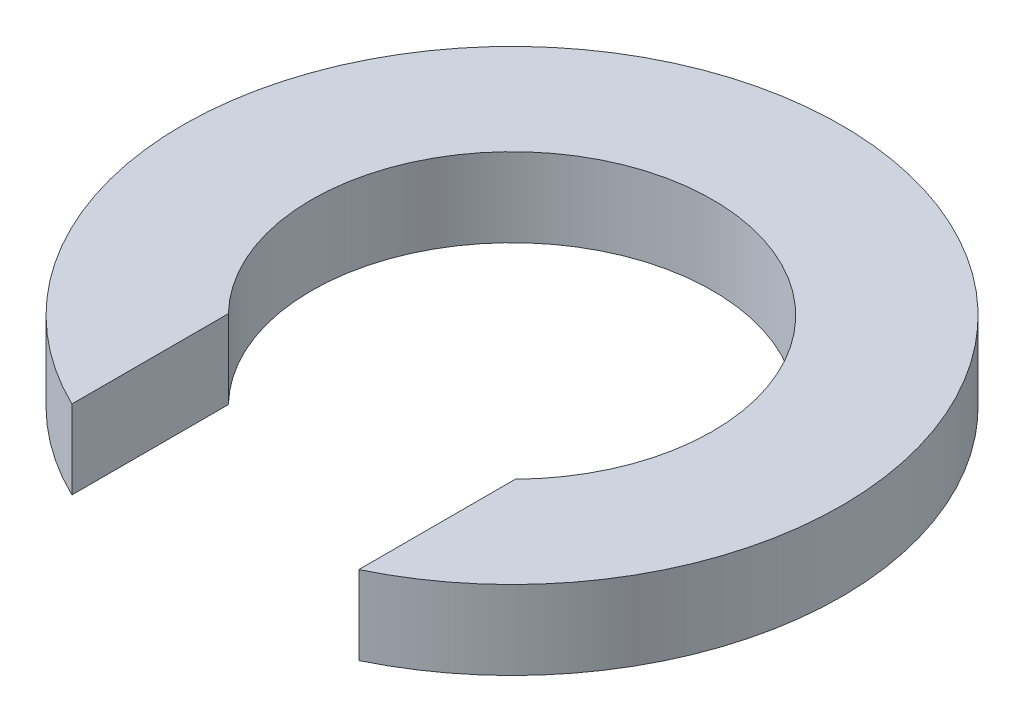
ISO-10303-21;
HEADER;
FILE_DESCRIPTION(('STEP AP214'),'2;1');
FILE_NAME('part.step','',(''),(''),'','','');
FILE_SCHEMA(('AUTOMOTIVE_DESIGN { 1 0 10303 214 1 1 1 1 }'));
ENDSEC;
DATA;
#1=APPLICATION_CONTEXT('core data for automotive mechanical design processes');
#2=APPLICATION_PROTOCOL_DEFINITION('international standard','automotive_design',2000,#1);
#3=PRODUCT_CONTEXT('',#1,'mechanical');
#4=PRODUCT('Part','Part','',(#3));
#5=PRODUCT_RELATED_PRODUCT_CATEGORY('part','',(#4));
#6=PRODUCT_DEFINITION_FORMATION('','',#4);
#7=PRODUCT_DEFINITION_CONTEXT('part definition',#1,'design');
#8=PRODUCT_DEFINITION('design','',#6,#7);
#9=PRODUCT_DEFINITION_SHAPE('','',#8);
#10=(LENGTH_UNIT() NAMED_UNIT(*) SI_UNIT(.MILLI.,.METRE.));
#11=(NAMED_UNIT(*) PLANE_ANGLE_UNIT() SI_UNIT($,.RADIAN.));
#12=(NAMED_UNIT(*) SI_UNIT($,.STERADIAN.) SOLID_ANGLE_UNIT());
#13=UNCERTAINTY_MEASURE_WITH_UNIT(LENGTH_MEASURE(1.E-05),#10,'distance_accuracy_value','');
#14=(GEOMETRIC_REPRESENTATION_CONTEXT(3) GLOBAL_UNCERTAINTY_ASSIGNED_CONTEXT((#13)) GLOBAL_UNIT_ASSIGNED_CONTEXT((#10,
#11,#12)) REPRESENTATION_CONTEXT('',''));
#15=CARTESIAN_POINT('',(0.,0.,0.));
#16=DIRECTION('',(0.,0.,1.));
#17=DIRECTION('',(1.,0.,0.));
#18=AXIS2_PLACEMENT_3D('',#15,#16,#17);
#19=CARTESIAN_POINT('',(0.,2.75,0.));
#20=DIRECTION('',(0.,1.,0.));
#21=DIRECTION('',(0.,0.,1.));
#22=AXIS2_PLACEMENT_3D('',#19,#20,#21);
#23=PLANE('',#22);
#24=DIRECTION('',(0.,0.,1.));
#25=VECTOR('',#24,1.);
#26=CARTESIAN_POINT('',(-5.0052393464597,2.75,4.89362637362638));
#27=LINE('',#26,#25);
#28=CARTESIAN_POINT('',(-5.0052393464597,2.75,4.89362637362638));
#29=VERTEX_POINT('',#28);
#30=CARTESIAN_POINT('',(-5.0052393464597,2.75,10.3536263736264));
#31=VERTEX_POINT('',#30);
#32=EDGE_CURVE('E122',#29,#31,#27,.T.);
#33=ORIENTED_EDGE('',*,*,#32,.F.);
#34=CARTESIAN_POINT('',(0.,2.75,0.));
#35=DIRECTION('',(0.,1.,0.));
#36=DIRECTION('',(0.,0.,1.));
#37=AXIS2_PLACEMENT_3D('',#34,#35,#36);
#38=CIRCLE('',#37,7.);
#39=CARTESIAN_POINT('',(5.00523934645971,2.75,4.89362637362637));
#40=VERTEX_POINT('',#39);
#41=EDGE_CURVE('E106',#40,#29,#38,.T.);
#42=ORIENTED_EDGE('',*,*,#41,.F.);
#43=DIRECTION('',(0.,0.,-1.));
#44=VECTOR('',#43,1.);
#45=CARTESIAN_POINT('',(5.00523934645971,2.75,4.89362637362637));
#46=LINE('',#45,#44);
#47=CARTESIAN_POINT('',(5.00523934645971,2.75,10.3536263736264));
#48=VERTEX_POINT('',#47);
#49=EDGE_CURVE('E69',#48,#40,#46,.T.);
#50=ORIENTED_EDGE('',*,*,#49,.F.);
#51=CARTESIAN_POINT('',(0.,2.75,0.));
#52=DIRECTION('',(0.,1.,0.));
#53=DIRECTION('',(0.,0.,1.));
#54=AXIS2_PLACEMENT_3D('',#51,#52,#53);
#55=CIRCLE('',#54,11.5);
#56=EDGE_CURVE('E11',#48,#31,#55,.T.);
#57=ORIENTED_EDGE('',*,*,#56,.T.);
#58=EDGE_LOOP('',(#33,#42,#50,#57));
#59=FACE_BOUND('',#58,.T.);
#60=ADVANCED_FACE('F45',(#59),#23,.T.);
#61=CARTESIAN_POINT('',(0.,0.,0.));
#62=DIRECTION('',(0.,1.,0.));
#63=DIRECTION('',(0.,0.,1.));
#64=AXIS2_PLACEMENT_3D('',#61,#62,#63);
#65=PLANE('',#64);
#66=CARTESIAN_POINT('',(0.,0.,0.));
#67=DIRECTION('',(0.,1.,0.));
#68=DIRECTION('',(0.,0.,1.));
#69=AXIS2_PLACEMENT_3D('',#66,#67,#68);
#70=CIRCLE('',#69,7.);
#71=CARTESIAN_POINT('',(5.00523934645971,0.,4.89362637362637));
#72=VERTEX_POINT('',#71);
#73=CARTESIAN_POINT('',(-5.00523934645971,0.,4.89362637362637));
#74=VERTEX_POINT('',#73);
#75=EDGE_CURVE('E100',#72,#74,#70,.T.);
#76=ORIENTED_EDGE('',*,*,#75,.T.);
#77=DIRECTION('',(0.,0.,1.));
#78=VECTOR('',#77,1.);
#79=CARTESIAN_POINT('',(-5.0052393464597,0.,4.89362637362638));
#80=LINE('',#79,#78);
#81=CARTESIAN_POINT('',(-5.0052393464597,0.,10.3536263736264));
#82=VERTEX_POINT('',#81);
#83=EDGE_CURVE('E61',#74,#82,#80,.T.);
#84=ORIENTED_EDGE('',*,*,#83,.T.);
#85=CARTESIAN_POINT('',(0.,0.,0.));
#86=DIRECTION('',(0.,1.,0.));
#87=DIRECTION('',(0.,0.,1.));
#88=AXIS2_PLACEMENT_3D('',#85,#86,#87);
#89=CIRCLE('',#88,11.5);
#90=CARTESIAN_POINT('',(5.00523934645971,0.,10.3536263736264));
#91=VERTEX_POINT('',#90);
#92=EDGE_CURVE('E49',#91,#82,#89,.T.);
#93=ORIENTED_EDGE('',*,*,#92,.F.);
#94=DIRECTION('',(0.,0.,-1.));
#95=VECTOR('',#94,1.);
#96=CARTESIAN_POINT('',(5.00523934645971,0.,4.89362637362637));
#97=LINE('',#96,#95);
#98=EDGE_CURVE('E87',#91,#72,#97,.T.);
#99=ORIENTED_EDGE('',*,*,#98,.T.);
#100=EDGE_LOOP('',(#76,#84,#93,#99));
#101=FACE_BOUND('',#100,.T.);
#102=ADVANCED_FACE('F99',(#101),#65,.F.);
#103=CARTESIAN_POINT('',(0.,2.75,0.));
#104=DIRECTION('',(0.,-1.,0.));
#105=DIRECTION('',(0.,0.,-1.));
#106=AXIS2_PLACEMENT_3D('',#103,#104,#105);
#107=CYLINDRICAL_SURFACE('',#106,11.5);
#108=ORIENTED_EDGE('',*,*,#92,.T.);
#109=DIRECTION('',(0.,-1.,0.));
#110=VECTOR('',#109,1.);
#111=CARTESIAN_POINT('',(-5.0052393464597,2.75,10.3536263736264));
#112=LINE('',#111,#110);
#113=EDGE_CURVE('E107',#82,#31,#112,.F.);
#114=ORIENTED_EDGE('',*,*,#113,.T.);
#115=ORIENTED_EDGE('',*,*,#56,.F.);
#116=DIRECTION('',(0.,-1.,0.));
#117=VECTOR('',#116,1.);
#118=CARTESIAN_POINT('',(5.00523934645971,2.75,10.3536263736264));
#119=LINE('',#118,#117);
#120=EDGE_CURVE('E113',#48,#91,#119,.T.);
#121=ORIENTED_EDGE('',*,*,#120,.T.);
#122=EDGE_LOOP('',(#108,#114,#115,#121));
#123=FACE_BOUND('',#122,.T.);
#124=ADVANCED_FACE('F47',(#123),#107,.T.);
#125=CARTESIAN_POINT('',(0.,2.75,0.));
#126=DIRECTION('',(0.,-1.,0.));
#127=DIRECTION('',(0.,0.,-1.));
#128=AXIS2_PLACEMENT_3D('',#125,#126,#127);
#129=CYLINDRICAL_SURFACE('',#128,7.);
#130=DIRECTION('',(0.,1.,0.));
#131=VECTOR('',#130,1.);
#132=CARTESIAN_POINT('',(-5.0052393464597,0.,4.89362637362638));
#133=LINE('',#132,#131);
#134=EDGE_CURVE('E94',#74,#29,#133,.T.);
#135=ORIENTED_EDGE('',*,*,#134,.F.);
#136=ORIENTED_EDGE('',*,*,#75,.F.);
#137=DIRECTION('',(0.,1.,0.));
#138=VECTOR('',#137,1.);
#139=CARTESIAN_POINT('',(5.00523934645971,0.,4.89362637362637));
#140=LINE('',#139,#138);
#141=EDGE_CURVE('E84',#72,#40,#140,.T.);
#142=ORIENTED_EDGE('',*,*,#141,.T.);
#143=ORIENTED_EDGE('',*,*,#41,.T.);
#144=EDGE_LOOP('',(#135,#136,#142,#143));
#145=FACE_BOUND('',#144,.T.);
#146=ADVANCED_FACE('F104',(#145),#129,.F.);
#147=CARTESIAN_POINT('',(5.00523934645971,0.,4.89362637362637));
#148=DIRECTION('',(1.,0.,0.));
#149=DIRECTION('',(0.,0.,-1.));
#150=AXIS2_PLACEMENT_3D('',#147,#148,#149);
#151=PLANE('',#150);
#152=ORIENTED_EDGE('',*,*,#49,.T.);
#153=ORIENTED_EDGE('',*,*,#141,.F.);
#154=ORIENTED_EDGE('',*,*,#98,.F.);
#155=ORIENTED_EDGE('',*,*,#120,.F.);
#156=EDGE_LOOP('',(#152,#153,#154,#155));
#157=FACE_BOUND('',#156,.T.);
#158=ADVANCED_FACE('F86',(#157),#151,.F.);
#159=CARTESIAN_POINT('',(-5.0052393464597,0.,4.89362637362638));
#160=DIRECTION('',(-1.,0.,0.));
#161=DIRECTION('',(0.,0.,1.));
#162=AXIS2_PLACEMENT_3D('',#159,#160,#161);
#163=PLANE('',#162);
#164=ORIENTED_EDGE('',*,*,#83,.F.);
#165=ORIENTED_EDGE('',*,*,#134,.T.);
#166=ORIENTED_EDGE('',*,*,#32,.T.);
#167=ORIENTED_EDGE('',*,*,#113,.F.);
#168=EDGE_LOOP('',(#164,#165,#166,#167));
#169=FACE_BOUND('',#168,.T.);
#170=ADVANCED_FACE('F131',(#169),#163,.F.);
#171=CLOSED_SHELL('',(#60,#102,#124,#146,#158,#170));
#172=MANIFOLD_SOLID_BREP('B2',#171);
#173=ADVANCED_BREP_SHAPE_REPRESENTATION('',(#18,#172),#14);
#174=SHAPE_DEFINITION_REPRESENTATION(#9,#173);
ENDSEC;
END-ISO-10303-21;
